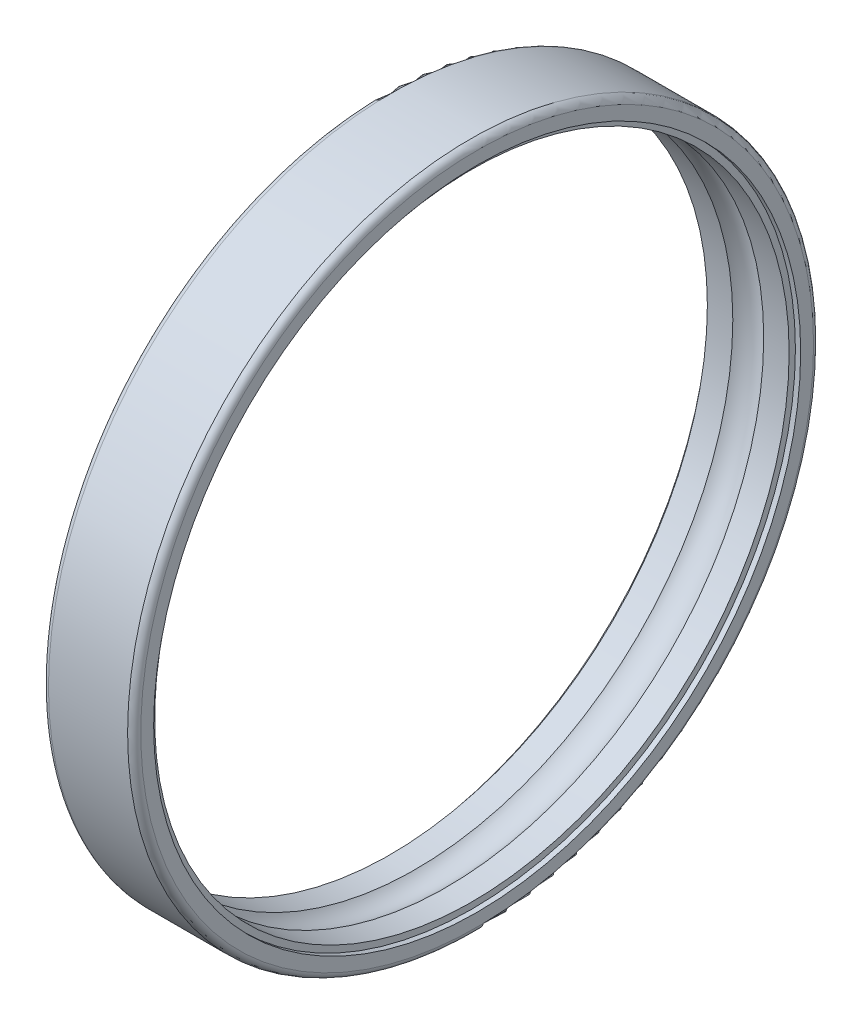
ISO-10303-21;
HEADER;
FILE_DESCRIPTION(('STEP AP214'),'2;1');
FILE_NAME('part.step','',(''),(''),'','','');
FILE_SCHEMA(('AUTOMOTIVE_DESIGN { 1 0 10303 214 1 1 1 1 }'));
ENDSEC;
DATA;
#1=APPLICATION_CONTEXT('core data for automotive mechanical design processes');
#2=APPLICATION_PROTOCOL_DEFINITION('international standard','automotive_design',2000,#1);
#3=PRODUCT_CONTEXT('',#1,'mechanical');
#4=PRODUCT('Part','Part','',(#3));
#5=PRODUCT_RELATED_PRODUCT_CATEGORY('part','',(#4));
#6=PRODUCT_DEFINITION_FORMATION('','',#4);
#7=PRODUCT_DEFINITION_CONTEXT('part definition',#1,'design');
#8=PRODUCT_DEFINITION('design','',#6,#7);
#9=PRODUCT_DEFINITION_SHAPE('','',#8);
#10=(LENGTH_UNIT() NAMED_UNIT(*) SI_UNIT(.MILLI.,.METRE.));
#11=(NAMED_UNIT(*) PLANE_ANGLE_UNIT() SI_UNIT($,.RADIAN.));
#12=(NAMED_UNIT(*) SI_UNIT($,.STERADIAN.) SOLID_ANGLE_UNIT());
#13=UNCERTAINTY_MEASURE_WITH_UNIT(LENGTH_MEASURE(1.E-05),#10,'distance_accuracy_value','');
#14=(GEOMETRIC_REPRESENTATION_CONTEXT(3) GLOBAL_UNCERTAINTY_ASSIGNED_CONTEXT((#13)) GLOBAL_UNIT_ASSIGNED_CONTEXT((#10,
#11,#12)) REPRESENTATION_CONTEXT('',''));
#15=CARTESIAN_POINT('',(0.,0.,0.));
#16=DIRECTION('',(0.,0.,1.));
#17=DIRECTION('',(1.,0.,0.));
#18=AXIS2_PLACEMENT_3D('',#15,#16,#17);
#19=CARTESIAN_POINT('',(0.59278273002006,0.,0.));
#20=DIRECTION('',(1.,0.,0.));
#21=DIRECTION('',(0.,0.,-1.));
#22=AXIS2_PLACEMENT_3D('',#19,#20,#21);
#23=TOROIDAL_SURFACE('',#22,25.4072172699799,0.600000000000008);
#24=CARTESIAN_POINT('',(0.499999999999993,0.,0.));
#25=DIRECTION('',(1.,0.,0.));
#26=DIRECTION('',(0.,0.,-1.));
#27=AXIS2_PLACEMENT_3D('',#24,#25,#26);
#28=CIRCLE('',#27,26.);
#29=CARTESIAN_POINT('',(0.499999999999993,0.,-26.));
#30=VERTEX_POINT('',#29);
#31=EDGE_CURVE('E10',#30,#30,#28,.T.);
#32=ORIENTED_EDGE('',*,*,#31,.F.);
#33=EDGE_LOOP('',(#32));
#34=FACE_BOUND('',#33,.T.);
#35=CARTESIAN_POINT('',(0.,0.,0.));
#36=DIRECTION('',(1.,0.,0.));
#37=DIRECTION('',(0.,0.,-1.));
#38=AXIS2_PLACEMENT_3D('',#35,#36,#37);
#39=CIRCLE('',#38,25.5);
#40=CARTESIAN_POINT('',(0.,0.,-25.5));
#41=VERTEX_POINT('',#40);
#42=EDGE_CURVE('E63',#41,#41,#39,.T.);
#43=ORIENTED_EDGE('',*,*,#42,.T.);
#44=EDGE_LOOP('',(#43));
#45=FACE_BOUND('',#44,.T.);
#46=ADVANCED_FACE('F15',(#34,#45),#23,.T.);
#47=CARTESIAN_POINT('',(7.,0.,0.));
#48=DIRECTION('',(1.,0.,0.));
#49=DIRECTION('',(0.,0.,-1.));
#50=AXIS2_PLACEMENT_3D('',#47,#48,#49);
#51=CYLINDRICAL_SURFACE('',#50,26.);
#52=CARTESIAN_POINT('',(6.5,0.,0.));
#53=DIRECTION('',(1.,0.,0.));
#54=DIRECTION('',(0.,0.,-1.));
#55=AXIS2_PLACEMENT_3D('',#52,#53,#54);
#56=CIRCLE('',#55,26.);
#57=CARTESIAN_POINT('',(6.5,0.,-26.));
#58=VERTEX_POINT('',#57);
#59=EDGE_CURVE('E22',#58,#58,#56,.T.);
#60=ORIENTED_EDGE('',*,*,#59,.F.);
#61=EDGE_LOOP('',(#60));
#62=FACE_BOUND('',#61,.T.);
#63=ORIENTED_EDGE('',*,*,#31,.T.);
#64=EDGE_LOOP('',(#63));
#65=FACE_BOUND('',#64,.T.);
#66=ADVANCED_FACE('F109',(#62,#65),#51,.T.);
#67=CARTESIAN_POINT('',(6.40721726997994,0.,0.));
#68=DIRECTION('',(1.,0.,0.));
#69=DIRECTION('',(0.,0.,-1.));
#70=AXIS2_PLACEMENT_3D('',#67,#68,#69);
#71=TOROIDAL_SURFACE('',#70,25.4072172699799,0.6);
#72=CARTESIAN_POINT('',(7.,0.,0.));
#73=DIRECTION('',(1.,0.,0.));
#74=DIRECTION('',(0.,0.,-1.));
#75=AXIS2_PLACEMENT_3D('',#72,#73,#74);
#76=CIRCLE('',#75,25.5);
#77=CARTESIAN_POINT('',(7.,0.,-25.5));
#78=VERTEX_POINT('',#77);
#79=EDGE_CURVE('E30',#78,#78,#76,.T.);
#80=ORIENTED_EDGE('',*,*,#79,.F.);
#81=EDGE_LOOP('',(#80));
#82=FACE_BOUND('',#81,.T.);
#83=ORIENTED_EDGE('',*,*,#59,.T.);
#84=EDGE_LOOP('',(#83));
#85=FACE_BOUND('',#84,.T.);
#86=ADVANCED_FACE('F114',(#82,#85),#71,.T.);
#87=CARTESIAN_POINT('',(7.,24.525,0.));
#88=DIRECTION('',(1.,0.,0.));
#89=DIRECTION('',(0.,1.,0.));
#90=AXIS2_PLACEMENT_3D('',#87,#88,#89);
#91=PLANE('',#90);
#92=CARTESIAN_POINT('',(7.,0.,0.));
#93=DIRECTION('',(1.,0.,0.));
#94=DIRECTION('',(0.,0.,-1.));
#95=AXIS2_PLACEMENT_3D('',#92,#93,#94);
#96=CIRCLE('',#95,24.525);
#97=CARTESIAN_POINT('',(7.,0.,-24.525));
#98=VERTEX_POINT('',#97);
#99=EDGE_CURVE('E37',#98,#98,#96,.T.);
#100=ORIENTED_EDGE('',*,*,#99,.F.);
#101=EDGE_LOOP('',(#100));
#102=FACE_BOUND('',#101,.T.);
#103=ORIENTED_EDGE('',*,*,#79,.T.);
#104=EDGE_LOOP('',(#103));
#105=FACE_BOUND('',#104,.T.);
#106=ADVANCED_FACE('F130',(#102,#105),#91,.T.);
#107=CARTESIAN_POINT('',(7.,0.,0.));
#108=DIRECTION('',(1.,0.,0.));
#109=DIRECTION('',(0.,0.,-1.));
#110=AXIS2_PLACEMENT_3D('',#107,#108,#109);
#111=CYLINDRICAL_SURFACE('',#110,24.525);
#112=CARTESIAN_POINT('',(6.6,0.,0.));
#113=DIRECTION('',(1.,0.,0.));
#114=DIRECTION('',(0.,0.,-1.));
#115=AXIS2_PLACEMENT_3D('',#112,#113,#114);
#116=CIRCLE('',#115,24.525);
#117=CARTESIAN_POINT('',(6.6,0.,-24.525));
#118=VERTEX_POINT('',#117);
#119=EDGE_CURVE('E42',#118,#118,#116,.T.);
#120=ORIENTED_EDGE('',*,*,#119,.F.);
#121=EDGE_LOOP('',(#120));
#122=FACE_BOUND('',#121,.T.);
#123=ORIENTED_EDGE('',*,*,#99,.T.);
#124=EDGE_LOOP('',(#123));
#125=FACE_BOUND('',#124,.T.);
#126=ADVANCED_FACE('F125',(#122,#125),#111,.F.);
#127=CARTESIAN_POINT('',(6.6,24.05,0.));
#128=DIRECTION('',(1.,0.,0.));
#129=DIRECTION('',(0.,1.,0.));
#130=AXIS2_PLACEMENT_3D('',#127,#128,#129);
#131=PLANE('',#130);
#132=CARTESIAN_POINT('',(6.6,0.,0.));
#133=DIRECTION('',(1.,0.,0.));
#134=DIRECTION('',(0.,0.,-1.));
#135=AXIS2_PLACEMENT_3D('',#132,#133,#134);
#136=CIRCLE('',#135,24.05);
#137=CARTESIAN_POINT('',(6.6,0.,-24.05));
#138=VERTEX_POINT('',#137);
#139=EDGE_CURVE('E46',#138,#138,#136,.T.);
#140=ORIENTED_EDGE('',*,*,#139,.F.);
#141=EDGE_LOOP('',(#140));
#142=FACE_BOUND('',#141,.T.);
#143=ORIENTED_EDGE('',*,*,#119,.T.);
#144=EDGE_LOOP('',(#143));
#145=FACE_BOUND('',#144,.T.);
#146=ADVANCED_FACE('F105',(#142,#145),#131,.T.);
#147=CARTESIAN_POINT('',(7.,0.,0.));
#148=DIRECTION('',(1.,0.,0.));
#149=DIRECTION('',(0.,0.,-1.));
#150=AXIS2_PLACEMENT_3D('',#147,#148,#149);
#151=CYLINDRICAL_SURFACE('',#150,24.05);
#152=CARTESIAN_POINT('',(4.671537451386,0.,0.));
#153=DIRECTION('',(1.,0.,0.));
#154=DIRECTION('',(0.,0.,-1.));
#155=AXIS2_PLACEMENT_3D('',#152,#153,#154);
#156=CIRCLE('',#155,24.05);
#157=CARTESIAN_POINT('',(4.671537451386,0.,-24.05));
#158=VERTEX_POINT('',#157);
#159=EDGE_CURVE('E50',#158,#158,#156,.T.);
#160=ORIENTED_EDGE('',*,*,#159,.F.);
#161=EDGE_LOOP('',(#160));
#162=FACE_BOUND('',#161,.T.);
#163=ORIENTED_EDGE('',*,*,#139,.T.);
#164=EDGE_LOOP('',(#163));
#165=FACE_BOUND('',#164,.T.);
#166=ADVANCED_FACE('F98',(#162,#165),#151,.F.);
#167=CARTESIAN_POINT('',(3.5,0.,0.));
#168=DIRECTION('',(1.,0.,0.));
#169=DIRECTION('',(0.,0.,-1.));
#170=AXIS2_PLACEMENT_3D('',#167,#168,#169);
#171=TOROIDAL_SURFACE('',#170,22.75,1.75);
#172=ORIENTED_EDGE('',*,*,#159,.T.);
#173=EDGE_LOOP('',(#172));
#174=FACE_BOUND('',#173,.T.);
#175=CARTESIAN_POINT('',(2.328462548614,0.,0.));
#176=DIRECTION('',(1.,0.,0.));
#177=DIRECTION('',(0.,0.,-1.));
#178=AXIS2_PLACEMENT_3D('',#175,#176,#177);
#179=CIRCLE('',#178,24.05);
#180=CARTESIAN_POINT('',(2.328462548614,0.,-24.05));
#181=VERTEX_POINT('',#180);
#182=EDGE_CURVE('E53',#181,#181,#179,.T.);
#183=ORIENTED_EDGE('',*,*,#182,.F.);
#184=EDGE_LOOP('',(#183));
#185=FACE_BOUND('',#184,.T.);
#186=ADVANCED_FACE('F93',(#174,#185),#171,.F.);
#187=CARTESIAN_POINT('',(7.,0.,0.));
#188=DIRECTION('',(1.,0.,0.));
#189=DIRECTION('',(0.,0.,-1.));
#190=AXIS2_PLACEMENT_3D('',#187,#188,#189);
#191=CYLINDRICAL_SURFACE('',#190,24.05);
#192=CARTESIAN_POINT('',(0.4,0.,0.));
#193=DIRECTION('',(1.,0.,0.));
#194=DIRECTION('',(0.,0.,-1.));
#195=AXIS2_PLACEMENT_3D('',#192,#193,#194);
#196=CIRCLE('',#195,24.05);
#197=CARTESIAN_POINT('',(0.4,0.,-24.05));
#198=VERTEX_POINT('',#197);
#199=EDGE_CURVE('E58',#198,#198,#196,.T.);
#200=ORIENTED_EDGE('',*,*,#199,.F.);
#201=EDGE_LOOP('',(#200));
#202=FACE_BOUND('',#201,.T.);
#203=ORIENTED_EDGE('',*,*,#182,.T.);
#204=EDGE_LOOP('',(#203));
#205=FACE_BOUND('',#204,.T.);
#206=ADVANCED_FACE('F87',(#202,#205),#191,.F.);
#207=CARTESIAN_POINT('',(0.4,24.525,0.));
#208=DIRECTION('',(-1.,0.,0.));
#209=DIRECTION('',(0.,0.,1.));
#210=AXIS2_PLACEMENT_3D('',#207,#208,#209);
#211=PLANE('',#210);
#212=CARTESIAN_POINT('',(0.4,0.,0.));
#213=DIRECTION('',(1.,0.,0.));
#214=DIRECTION('',(0.,0.,-1.));
#215=AXIS2_PLACEMENT_3D('',#212,#213,#214);
#216=CIRCLE('',#215,24.525);
#217=CARTESIAN_POINT('',(0.4,0.,-24.525));
#218=VERTEX_POINT('',#217);
#219=EDGE_CURVE('E59',#218,#218,#216,.T.);
#220=ORIENTED_EDGE('',*,*,#219,.F.);
#221=EDGE_LOOP('',(#220));
#222=FACE_BOUND('',#221,.T.);
#223=ORIENTED_EDGE('',*,*,#199,.T.);
#224=EDGE_LOOP('',(#223));
#225=FACE_BOUND('',#224,.T.);
#226=ADVANCED_FACE('F81',(#222,#225),#211,.T.);
#227=CARTESIAN_POINT('',(7.,0.,0.));
#228=DIRECTION('',(1.,0.,0.));
#229=DIRECTION('',(0.,0.,-1.));
#230=AXIS2_PLACEMENT_3D('',#227,#228,#229);
#231=CYLINDRICAL_SURFACE('',#230,24.525);
#232=CARTESIAN_POINT('',(0.,0.,0.));
#233=DIRECTION('',(1.,0.,0.));
#234=DIRECTION('',(0.,0.,-1.));
#235=AXIS2_PLACEMENT_3D('',#232,#233,#234);
#236=CIRCLE('',#235,24.525);
#237=CARTESIAN_POINT('',(0.,0.,-24.525));
#238=VERTEX_POINT('',#237);
#239=EDGE_CURVE('E67',#238,#238,#236,.T.);
#240=ORIENTED_EDGE('',*,*,#239,.F.);
#241=EDGE_LOOP('',(#240));
#242=FACE_BOUND('',#241,.T.);
#243=ORIENTED_EDGE('',*,*,#219,.T.);
#244=EDGE_LOOP('',(#243));
#245=FACE_BOUND('',#244,.T.);
#246=ADVANCED_FACE('F78',(#242,#245),#231,.F.);
#247=CARTESIAN_POINT('',(0.,25.5,0.));
#248=DIRECTION('',(-1.,0.,0.));
#249=DIRECTION('',(0.,0.,1.));
#250=AXIS2_PLACEMENT_3D('',#247,#248,#249);
#251=PLANE('',#250);
#252=ORIENTED_EDGE('',*,*,#42,.F.);
#253=EDGE_LOOP('',(#252));
#254=FACE_BOUND('',#253,.T.);
#255=ORIENTED_EDGE('',*,*,#239,.T.);
#256=EDGE_LOOP('',(#255));
#257=FACE_BOUND('',#256,.T.);
#258=ADVANCED_FACE('F76',(#254,#257),#251,.T.);
#259=CLOSED_SHELL('',(#46,#66,#86,#106,#126,#146,#166,#186,#206,#226,#246,#258));
#260=MANIFOLD_SOLID_BREP('B1',#259);
#261=ADVANCED_BREP_SHAPE_REPRESENTATION('',(#18,#260),#14);
#262=SHAPE_DEFINITION_REPRESENTATION(#9,#261);
ENDSEC;
END-ISO-10303-21;
